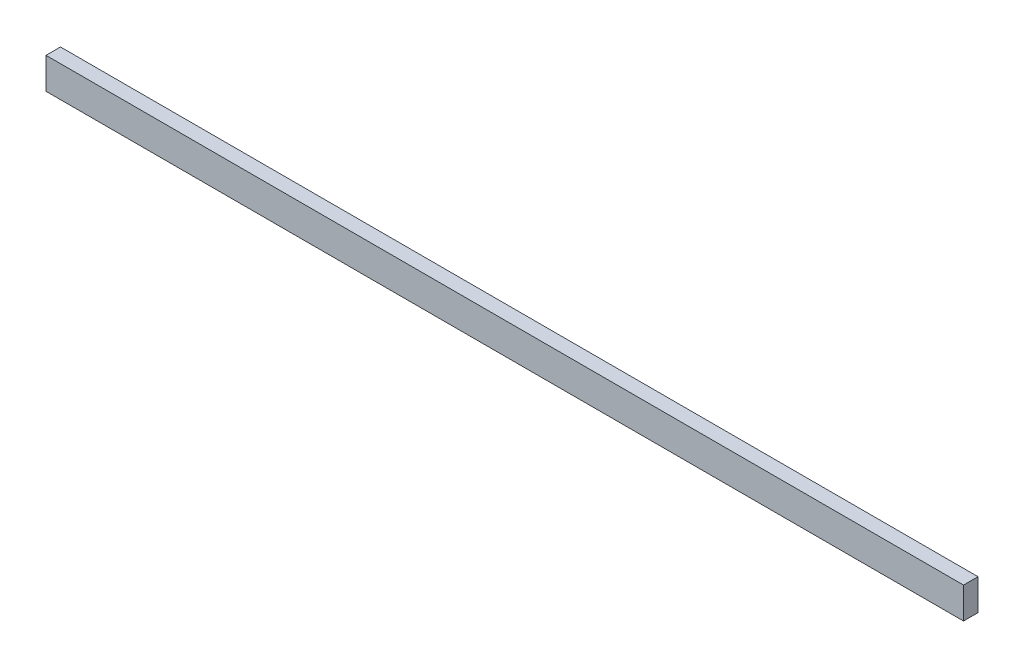
ISO-10303-21;
HEADER;
FILE_DESCRIPTION(('STEP AP214'),'2;1');
FILE_NAME('part.step','',(''),(''),'','','');
FILE_SCHEMA(('AUTOMOTIVE_DESIGN { 1 0 10303 214 1 1 1 1 }'));
ENDSEC;
DATA;
#1=APPLICATION_CONTEXT('core data for automotive mechanical design processes');
#2=APPLICATION_PROTOCOL_DEFINITION('international standard','automotive_design',2000,#1);
#3=PRODUCT_CONTEXT('',#1,'mechanical');
#4=PRODUCT('Part','Part','',(#3));
#5=PRODUCT_RELATED_PRODUCT_CATEGORY('part','',(#4));
#6=PRODUCT_DEFINITION_FORMATION('','',#4);
#7=PRODUCT_DEFINITION_CONTEXT('part definition',#1,'design');
#8=PRODUCT_DEFINITION('design','',#6,#7);
#9=PRODUCT_DEFINITION_SHAPE('','',#8);
#10=(LENGTH_UNIT() NAMED_UNIT(*) SI_UNIT(.MILLI.,.METRE.));
#11=(NAMED_UNIT(*) PLANE_ANGLE_UNIT() SI_UNIT($,.RADIAN.));
#12=(NAMED_UNIT(*) SI_UNIT($,.STERADIAN.) SOLID_ANGLE_UNIT());
#13=UNCERTAINTY_MEASURE_WITH_UNIT(LENGTH_MEASURE(1.E-05),#10,'distance_accuracy_value','');
#14=(GEOMETRIC_REPRESENTATION_CONTEXT(3) GLOBAL_UNCERTAINTY_ASSIGNED_CONTEXT((#13)) GLOBAL_UNIT_ASSIGNED_CONTEXT((#10,
#11,#12)) REPRESENTATION_CONTEXT('',''));
#15=CARTESIAN_POINT('',(0.,0.,0.));
#16=DIRECTION('',(0.,0.,1.));
#17=DIRECTION('',(1.,0.,0.));
#18=AXIS2_PLACEMENT_3D('',#15,#16,#17);
#19=CARTESIAN_POINT('',(120.65,8.2,1.905));
#20=DIRECTION('',(-1.,0.,0.));
#21=DIRECTION('',(0.,0.,1.));
#22=AXIS2_PLACEMENT_3D('',#19,#20,#21);
#23=PLANE('',#22);
#24=DIRECTION('',(0.,0.,-1.));
#25=VECTOR('',#24,1.);
#26=CARTESIAN_POINT('',(120.65,0.,1.905));
#27=LINE('',#26,#25);
#28=CARTESIAN_POINT('',(120.65,0.,1.905));
#29=VERTEX_POINT('',#28);
#30=CARTESIAN_POINT('',(120.65,0.,-1.905));
#31=VERTEX_POINT('',#30);
#32=EDGE_CURVE('E111',#29,#31,#27,.T.);
#33=ORIENTED_EDGE('',*,*,#32,.T.);
#34=DIRECTION('',(0.,-1.,0.));
#35=VECTOR('',#34,1.);
#36=CARTESIAN_POINT('',(120.65,8.2,-1.905));
#37=LINE('',#36,#35);
#38=CARTESIAN_POINT('',(120.65,8.2,-1.905));
#39=VERTEX_POINT('',#38);
#40=EDGE_CURVE('E11',#39,#31,#37,.T.);
#41=ORIENTED_EDGE('',*,*,#40,.F.);
#42=DIRECTION('',(0.,0.,-1.));
#43=VECTOR('',#42,1.);
#44=CARTESIAN_POINT('',(120.65,8.2,1.905));
#45=LINE('',#44,#43);
#46=CARTESIAN_POINT('',(120.65,8.2,1.905));
#47=VERTEX_POINT('',#46);
#48=EDGE_CURVE('E95',#47,#39,#45,.T.);
#49=ORIENTED_EDGE('',*,*,#48,.F.);
#50=DIRECTION('',(0.,-1.,0.));
#51=VECTOR('',#50,1.);
#52=CARTESIAN_POINT('',(120.65,8.2,1.905));
#53=LINE('',#52,#51);
#54=EDGE_CURVE('E107',#47,#29,#53,.T.);
#55=ORIENTED_EDGE('',*,*,#54,.T.);
#56=EDGE_LOOP('',(#33,#41,#49,#55));
#57=FACE_BOUND('',#56,.T.);
#58=ADVANCED_FACE('F43',(#57),#23,.F.);
#59=CARTESIAN_POINT('',(-120.65,8.2,-1.905));
#60=DIRECTION('',(0.,0.,1.));
#61=DIRECTION('',(1.,0.,0.));
#62=AXIS2_PLACEMENT_3D('',#59,#60,#61);
#63=PLANE('',#62);
#64=DIRECTION('',(-1.,0.,0.));
#65=VECTOR('',#64,1.);
#66=CARTESIAN_POINT('',(-120.65,0.,-1.905));
#67=LINE('',#66,#65);
#68=CARTESIAN_POINT('',(-120.65,0.,-1.905));
#69=VERTEX_POINT('',#68);
#70=EDGE_CURVE('E100',#31,#69,#67,.T.);
#71=ORIENTED_EDGE('',*,*,#70,.T.);
#72=DIRECTION('',(0.,-1.,0.));
#73=VECTOR('',#72,1.);
#74=CARTESIAN_POINT('',(-120.65,8.2,-1.905));
#75=LINE('',#74,#73);
#76=CARTESIAN_POINT('',(-120.65,8.2,-1.905));
#77=VERTEX_POINT('',#76);
#78=EDGE_CURVE('E52',#77,#69,#75,.T.);
#79=ORIENTED_EDGE('',*,*,#78,.F.);
#80=DIRECTION('',(-1.,0.,0.));
#81=VECTOR('',#80,1.);
#82=CARTESIAN_POINT('',(-120.65,8.2,-1.905));
#83=LINE('',#82,#81);
#84=EDGE_CURVE('E90',#39,#77,#83,.T.);
#85=ORIENTED_EDGE('',*,*,#84,.F.);
#86=ORIENTED_EDGE('',*,*,#40,.T.);
#87=EDGE_LOOP('',(#71,#79,#85,#86));
#88=FACE_BOUND('',#87,.T.);
#89=ADVANCED_FACE('F99',(#88),#63,.F.);
#90=CARTESIAN_POINT('',(-120.65,8.2,1.905));
#91=DIRECTION('',(1.,0.,0.));
#92=DIRECTION('',(0.,0.,-1.));
#93=AXIS2_PLACEMENT_3D('',#90,#91,#92);
#94=PLANE('',#93);
#95=DIRECTION('',(0.,0.,1.));
#96=VECTOR('',#95,1.);
#97=CARTESIAN_POINT('',(-120.65,0.,1.905));
#98=LINE('',#97,#96);
#99=CARTESIAN_POINT('',(-120.65,0.,1.905));
#100=VERTEX_POINT('',#99);
#101=EDGE_CURVE('E77',#69,#100,#98,.T.);
#102=ORIENTED_EDGE('',*,*,#101,.T.);
#103=DIRECTION('',(0.,-1.,0.));
#104=VECTOR('',#103,1.);
#105=CARTESIAN_POINT('',(-120.65,8.2,1.905));
#106=LINE('',#105,#104);
#107=CARTESIAN_POINT('',(-120.65,8.2,1.905));
#108=VERTEX_POINT('',#107);
#109=EDGE_CURVE('E102',#108,#100,#106,.T.);
#110=ORIENTED_EDGE('',*,*,#109,.F.);
#111=DIRECTION('',(0.,0.,1.));
#112=VECTOR('',#111,1.);
#113=CARTESIAN_POINT('',(-120.65,8.2,1.905));
#114=LINE('',#113,#112);
#115=EDGE_CURVE('E93',#77,#108,#114,.T.);
#116=ORIENTED_EDGE('',*,*,#115,.F.);
#117=ORIENTED_EDGE('',*,*,#78,.T.);
#118=EDGE_LOOP('',(#102,#110,#116,#117));
#119=FACE_BOUND('',#118,.T.);
#120=ADVANCED_FACE('F103',(#119),#94,.F.);
#121=CARTESIAN_POINT('',(-120.65,8.2,1.905));
#122=DIRECTION('',(0.,0.,-1.));
#123=DIRECTION('',(-1.,0.,0.));
#124=AXIS2_PLACEMENT_3D('',#121,#122,#123);
#125=PLANE('',#124);
#126=DIRECTION('',(1.,0.,0.));
#127=VECTOR('',#126,1.);
#128=CARTESIAN_POINT('',(-120.65,0.,1.905));
#129=LINE('',#128,#127);
#130=EDGE_CURVE('E83',#100,#29,#129,.T.);
#131=ORIENTED_EDGE('',*,*,#130,.T.);
#132=ORIENTED_EDGE('',*,*,#54,.F.);
#133=DIRECTION('',(1.,0.,0.));
#134=VECTOR('',#133,1.);
#135=CARTESIAN_POINT('',(-120.65,8.2,1.905));
#136=LINE('',#135,#134);
#137=EDGE_CURVE('E60',#108,#47,#136,.T.);
#138=ORIENTED_EDGE('',*,*,#137,.F.);
#139=ORIENTED_EDGE('',*,*,#109,.T.);
#140=EDGE_LOOP('',(#131,#132,#138,#139));
#141=FACE_BOUND('',#140,.T.);
#142=ADVANCED_FACE('F124',(#141),#125,.F.);
#143=CARTESIAN_POINT('',(0.,8.2,0.));
#144=DIRECTION('',(0.,-1.,0.));
#145=DIRECTION('',(0.,0.,-1.));
#146=AXIS2_PLACEMENT_3D('',#143,#144,#145);
#147=PLANE('',#146);
#148=ORIENTED_EDGE('',*,*,#48,.T.);
#149=ORIENTED_EDGE('',*,*,#84,.T.);
#150=ORIENTED_EDGE('',*,*,#115,.T.);
#151=ORIENTED_EDGE('',*,*,#137,.T.);
#152=EDGE_LOOP('',(#148,#149,#150,#151));
#153=FACE_BOUND('',#152,.T.);
#154=ADVANCED_FACE('F91',(#153),#147,.F.);
#155=CARTESIAN_POINT('',(0.,0.,0.));
#156=DIRECTION('',(0.,-1.,0.));
#157=DIRECTION('',(0.,0.,-1.));
#158=AXIS2_PLACEMENT_3D('',#155,#156,#157);
#159=PLANE('',#158);
#160=ORIENTED_EDGE('',*,*,#32,.F.);
#161=ORIENTED_EDGE('',*,*,#130,.F.);
#162=ORIENTED_EDGE('',*,*,#101,.F.);
#163=ORIENTED_EDGE('',*,*,#70,.F.);
#164=EDGE_LOOP('',(#160,#161,#162,#163));
#165=FACE_BOUND('',#164,.T.);
#166=ADVANCED_FACE('F127',(#165),#159,.T.);
#167=CLOSED_SHELL('',(#58,#89,#120,#142,#154,#166));
#168=MANIFOLD_SOLID_BREP('B2',#167);
#169=ADVANCED_BREP_SHAPE_REPRESENTATION('',(#18,#168),#14);
#170=SHAPE_DEFINITION_REPRESENTATION(#9,#169);
ENDSEC;
END-ISO-10303-21;
